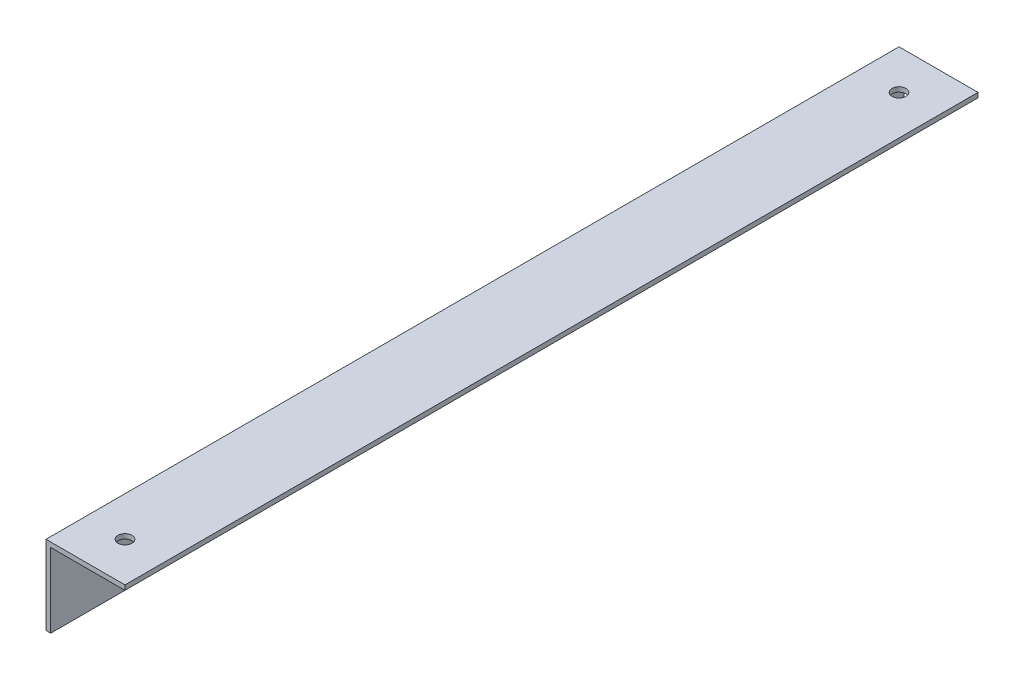
ISO-10303-21;
HEADER;
FILE_DESCRIPTION(('STEP AP214'),'2;1');
FILE_NAME('part.step','',(''),(''),'','','');
FILE_SCHEMA(('AUTOMOTIVE_DESIGN { 1 0 10303 214 1 1 1 1 }'));
ENDSEC;
DATA;
#1=APPLICATION_CONTEXT('core data for automotive mechanical design processes');
#2=APPLICATION_PROTOCOL_DEFINITION('international standard','automotive_design',2000,#1);
#3=PRODUCT_CONTEXT('',#1,'mechanical');
#4=PRODUCT('Part','Part','',(#3));
#5=PRODUCT_RELATED_PRODUCT_CATEGORY('part','',(#4));
#6=PRODUCT_DEFINITION_FORMATION('','',#4);
#7=PRODUCT_DEFINITION_CONTEXT('part definition',#1,'design');
#8=PRODUCT_DEFINITION('design','',#6,#7);
#9=PRODUCT_DEFINITION_SHAPE('','',#8);
#10=(LENGTH_UNIT() NAMED_UNIT(*) SI_UNIT(.MILLI.,.METRE.));
#11=(NAMED_UNIT(*) PLANE_ANGLE_UNIT() SI_UNIT($,.RADIAN.));
#12=(NAMED_UNIT(*) SI_UNIT($,.STERADIAN.) SOLID_ANGLE_UNIT());
#13=UNCERTAINTY_MEASURE_WITH_UNIT(LENGTH_MEASURE(1.E-05),#10,'distance_accuracy_value','');
#14=(GEOMETRIC_REPRESENTATION_CONTEXT(3) GLOBAL_UNCERTAINTY_ASSIGNED_CONTEXT((#13)) GLOBAL_UNIT_ASSIGNED_CONTEXT((#10,
#11,#12)) REPRESENTATION_CONTEXT('',''));
#15=CARTESIAN_POINT('',(0.,0.,0.));
#16=DIRECTION('',(0.,0.,1.));
#17=DIRECTION('',(1.,0.,0.));
#18=AXIS2_PLACEMENT_3D('',#15,#16,#17);
#19=CARTESIAN_POINT('',(0.,0.,270.));
#20=DIRECTION('',(0.,-1.,0.));
#21=DIRECTION('',(0.,0.,-1.));
#22=AXIS2_PLACEMENT_3D('',#19,#20,#21);
#23=PLANE('',#22);
#24=CARTESIAN_POINT('',(12.5,0.,257.5));
#25=DIRECTION('',(0.,1.,0.));
#26=DIRECTION('',(0.,0.,1.));
#27=AXIS2_PLACEMENT_3D('',#24,#25,#26);
#28=CIRCLE('',#27,2.19999999999999);
#29=CARTESIAN_POINT('',(12.5,0.,259.7));
#30=VERTEX_POINT('',#29);
#31=EDGE_CURVE('E163',#30,#30,#28,.T.);
#32=ORIENTED_EDGE('',*,*,#31,.F.);
#33=EDGE_LOOP('',(#32));
#34=FACE_BOUND('',#33,.T.);
#35=CARTESIAN_POINT('',(12.5,0.,12.5));
#36=DIRECTION('',(0.,1.,0.));
#37=DIRECTION('',(0.,0.,1.));
#38=AXIS2_PLACEMENT_3D('',#35,#36,#37);
#39=CIRCLE('',#38,2.2);
#40=CARTESIAN_POINT('',(12.5,0.,14.7));
#41=VERTEX_POINT('',#40);
#42=EDGE_CURVE('E166',#41,#41,#39,.T.);
#43=ORIENTED_EDGE('',*,*,#42,.F.);
#44=EDGE_LOOP('',(#43));
#45=FACE_BOUND('',#44,.T.);
#46=DIRECTION('',(-1.,0.,0.));
#47=VECTOR('',#46,1.);
#48=CARTESIAN_POINT('',(0.,0.,0.));
#49=LINE('',#48,#47);
#50=CARTESIAN_POINT('',(25.,0.,0.));
#51=VERTEX_POINT('',#50);
#52=CARTESIAN_POINT('',(0.,0.,0.));
#53=VERTEX_POINT('',#52);
#54=EDGE_CURVE('E117',#51,#53,#49,.T.);
#55=ORIENTED_EDGE('',*,*,#54,.T.);
#56=DIRECTION('',(0.,0.,-1.));
#57=VECTOR('',#56,1.);
#58=CARTESIAN_POINT('',(0.,0.,270.));
#59=LINE('',#58,#57);
#60=CARTESIAN_POINT('',(0.,0.,270.));
#61=VERTEX_POINT('',#60);
#62=EDGE_CURVE('E11',#61,#53,#59,.T.);
#63=ORIENTED_EDGE('',*,*,#62,.F.);
#64=DIRECTION('',(-1.,0.,0.));
#65=VECTOR('',#64,1.);
#66=CARTESIAN_POINT('',(0.,0.,270.));
#67=LINE('',#66,#65);
#68=CARTESIAN_POINT('',(25.,0.,270.));
#69=VERTEX_POINT('',#68);
#70=EDGE_CURVE('E128',#69,#61,#67,.T.);
#71=ORIENTED_EDGE('',*,*,#70,.F.);
#72=DIRECTION('',(0.,0.,-1.));
#73=VECTOR('',#72,1.);
#74=CARTESIAN_POINT('',(25.,0.,270.));
#75=LINE('',#74,#73);
#76=EDGE_CURVE('E113',#69,#51,#75,.T.);
#77=ORIENTED_EDGE('',*,*,#76,.T.);
#78=EDGE_LOOP('',(#55,#63,#71,#77));
#79=FACE_BOUND('',#78,.T.);
#80=ADVANCED_FACE('F33',(#34,#45,#79),#23,.F.);
#81=CARTESIAN_POINT('',(0.,0.,270.));
#82=DIRECTION('',(1.,0.,0.));
#83=DIRECTION('',(0.,1.,0.));
#84=AXIS2_PLACEMENT_3D('',#81,#82,#83);
#85=PLANE('',#84);
#86=DIRECTION('',(0.,-1.,0.));
#87=VECTOR('',#86,1.);
#88=CARTESIAN_POINT('',(0.,0.,0.));
#89=LINE('',#88,#87);
#90=CARTESIAN_POINT('',(0.,-25.,0.));
#91=VERTEX_POINT('',#90);
#92=EDGE_CURVE('E120',#53,#91,#89,.T.);
#93=ORIENTED_EDGE('',*,*,#92,.T.);
#94=DIRECTION('',(0.,0.,-1.));
#95=VECTOR('',#94,1.);
#96=CARTESIAN_POINT('',(0.,-25.,270.));
#97=LINE('',#96,#95);
#98=CARTESIAN_POINT('',(0.,-25.,270.));
#99=VERTEX_POINT('',#98);
#100=EDGE_CURVE('E41',#99,#91,#97,.T.);
#101=ORIENTED_EDGE('',*,*,#100,.F.);
#102=DIRECTION('',(0.,-1.,0.));
#103=VECTOR('',#102,1.);
#104=CARTESIAN_POINT('',(0.,0.,270.));
#105=LINE('',#104,#103);
#106=EDGE_CURVE('E86',#61,#99,#105,.T.);
#107=ORIENTED_EDGE('',*,*,#106,.F.);
#108=ORIENTED_EDGE('',*,*,#62,.T.);
#109=EDGE_LOOP('',(#93,#101,#107,#108));
#110=FACE_BOUND('',#109,.T.);
#111=ADVANCED_FACE('F154',(#110),#85,.F.);
#112=CARTESIAN_POINT('',(0.,-25.,270.));
#113=DIRECTION('',(0.,1.,0.));
#114=DIRECTION('',(0.,0.,1.));
#115=AXIS2_PLACEMENT_3D('',#112,#113,#114);
#116=PLANE('',#115);
#117=DIRECTION('',(1.,0.,0.));
#118=VECTOR('',#117,1.);
#119=CARTESIAN_POINT('',(0.,-25.,0.));
#120=LINE('',#119,#118);
#121=CARTESIAN_POINT('',(1.5,-25.,0.));
#122=VERTEX_POINT('',#121);
#123=EDGE_CURVE('E123',#91,#122,#120,.T.);
#124=ORIENTED_EDGE('',*,*,#123,.T.);
#125=DIRECTION('',(0.,0.,-1.));
#126=VECTOR('',#125,1.);
#127=CARTESIAN_POINT('',(1.5,-25.,270.));
#128=LINE('',#127,#126);
#129=CARTESIAN_POINT('',(1.5,-25.,270.));
#130=VERTEX_POINT('',#129);
#131=EDGE_CURVE('E108',#130,#122,#128,.T.);
#132=ORIENTED_EDGE('',*,*,#131,.F.);
#133=DIRECTION('',(1.,0.,0.));
#134=VECTOR('',#133,1.);
#135=CARTESIAN_POINT('',(0.,-25.,270.));
#136=LINE('',#135,#134);
#137=EDGE_CURVE('E99',#99,#130,#136,.T.);
#138=ORIENTED_EDGE('',*,*,#137,.F.);
#139=ORIENTED_EDGE('',*,*,#100,.T.);
#140=EDGE_LOOP('',(#124,#132,#138,#139));
#141=FACE_BOUND('',#140,.T.);
#142=ADVANCED_FACE('F134',(#141),#116,.F.);
#143=CARTESIAN_POINT('',(1.5,-25.,270.));
#144=DIRECTION('',(-1.,0.,0.));
#145=DIRECTION('',(0.,0.,1.));
#146=AXIS2_PLACEMENT_3D('',#143,#144,#145);
#147=PLANE('',#146);
#148=DIRECTION('',(0.,1.,0.));
#149=VECTOR('',#148,1.);
#150=CARTESIAN_POINT('',(1.5,-25.,0.));
#151=LINE('',#150,#149);
#152=CARTESIAN_POINT('',(1.5,-1.5,0.));
#153=VERTEX_POINT('',#152);
#154=EDGE_CURVE('E107',#122,#153,#151,.T.);
#155=ORIENTED_EDGE('',*,*,#154,.T.);
#156=DIRECTION('',(0.,0.,-1.));
#157=VECTOR('',#156,1.);
#158=CARTESIAN_POINT('',(1.5,-1.5,270.));
#159=LINE('',#158,#157);
#160=CARTESIAN_POINT('',(1.5,-1.5,270.));
#161=VERTEX_POINT('',#160);
#162=EDGE_CURVE('E104',#161,#153,#159,.T.);
#163=ORIENTED_EDGE('',*,*,#162,.F.);
#164=DIRECTION('',(0.,1.,0.));
#165=VECTOR('',#164,1.);
#166=CARTESIAN_POINT('',(1.5,-25.,270.));
#167=LINE('',#166,#165);
#168=EDGE_CURVE('E93',#130,#161,#167,.T.);
#169=ORIENTED_EDGE('',*,*,#168,.F.);
#170=ORIENTED_EDGE('',*,*,#131,.T.);
#171=EDGE_LOOP('',(#155,#163,#169,#170));
#172=FACE_BOUND('',#171,.T.);
#173=ADVANCED_FACE('F105',(#172),#147,.F.);
#174=CARTESIAN_POINT('',(1.5,-1.5,270.));
#175=DIRECTION('',(0.,1.,0.));
#176=DIRECTION('',(0.,0.,1.));
#177=AXIS2_PLACEMENT_3D('',#174,#175,#176);
#178=PLANE('',#177);
#179=CARTESIAN_POINT('',(12.5,-1.5,257.5));
#180=DIRECTION('',(0.,1.,0.));
#181=DIRECTION('',(0.,0.,1.));
#182=AXIS2_PLACEMENT_3D('',#179,#180,#181);
#183=CIRCLE('',#182,2.19999999999999);
#184=CARTESIAN_POINT('',(12.5,-1.5,259.7));
#185=VERTEX_POINT('',#184);
#186=EDGE_CURVE('E121',#185,#185,#183,.F.);
#187=ORIENTED_EDGE('',*,*,#186,.F.);
#188=EDGE_LOOP('',(#187));
#189=FACE_BOUND('',#188,.T.);
#190=CARTESIAN_POINT('',(12.5,-1.5,12.5));
#191=DIRECTION('',(0.,1.,0.));
#192=DIRECTION('',(0.,0.,1.));
#193=AXIS2_PLACEMENT_3D('',#190,#191,#192);
#194=CIRCLE('',#193,2.2);
#195=CARTESIAN_POINT('',(12.5,-1.5,14.7));
#196=VERTEX_POINT('',#195);
#197=EDGE_CURVE('E168',#196,#196,#194,.F.);
#198=ORIENTED_EDGE('',*,*,#197,.F.);
#199=EDGE_LOOP('',(#198));
#200=FACE_BOUND('',#199,.T.);
#201=DIRECTION('',(1.,0.,0.));
#202=VECTOR('',#201,1.);
#203=CARTESIAN_POINT('',(1.5,-1.5,0.));
#204=LINE('',#203,#202);
#205=CARTESIAN_POINT('',(25.,-1.5,0.));
#206=VERTEX_POINT('',#205);
#207=EDGE_CURVE('E72',#153,#206,#204,.T.);
#208=ORIENTED_EDGE('',*,*,#207,.T.);
#209=DIRECTION('',(0.,0.,-1.));
#210=VECTOR('',#209,1.);
#211=CARTESIAN_POINT('',(25.,-1.5,270.));
#212=LINE('',#211,#210);
#213=CARTESIAN_POINT('',(25.,-1.5,270.));
#214=VERTEX_POINT('',#213);
#215=EDGE_CURVE('E109',#214,#206,#212,.T.);
#216=ORIENTED_EDGE('',*,*,#215,.F.);
#217=DIRECTION('',(1.,0.,0.));
#218=VECTOR('',#217,1.);
#219=CARTESIAN_POINT('',(1.5,-1.5,270.));
#220=LINE('',#219,#218);
#221=EDGE_CURVE('E97',#161,#214,#220,.T.);
#222=ORIENTED_EDGE('',*,*,#221,.F.);
#223=ORIENTED_EDGE('',*,*,#162,.T.);
#224=EDGE_LOOP('',(#208,#216,#222,#223));
#225=FACE_BOUND('',#224,.T.);
#226=ADVANCED_FACE('F111',(#189,#200,#225),#178,.F.);
#227=CARTESIAN_POINT('',(25.,-1.5,270.));
#228=DIRECTION('',(-1.,0.,0.));
#229=DIRECTION('',(0.,0.,1.));
#230=AXIS2_PLACEMENT_3D('',#227,#228,#229);
#231=PLANE('',#230);
#232=DIRECTION('',(0.,1.,0.));
#233=VECTOR('',#232,1.);
#234=CARTESIAN_POINT('',(25.,-1.5,0.));
#235=LINE('',#234,#233);
#236=EDGE_CURVE('E78',#206,#51,#235,.T.);
#237=ORIENTED_EDGE('',*,*,#236,.T.);
#238=ORIENTED_EDGE('',*,*,#76,.F.);
#239=DIRECTION('',(0.,1.,0.));
#240=VECTOR('',#239,1.);
#241=CARTESIAN_POINT('',(25.,-1.5,270.));
#242=LINE('',#241,#240);
#243=EDGE_CURVE('E49',#214,#69,#242,.T.);
#244=ORIENTED_EDGE('',*,*,#243,.F.);
#245=ORIENTED_EDGE('',*,*,#215,.T.);
#246=EDGE_LOOP('',(#237,#238,#244,#245));
#247=FACE_BOUND('',#246,.T.);
#248=ADVANCED_FACE('F141',(#247),#231,.F.);
#249=CARTESIAN_POINT('',(0.,0.,270.));
#250=DIRECTION('',(0.,0.,1.));
#251=DIRECTION('',(1.,0.,0.));
#252=AXIS2_PLACEMENT_3D('',#249,#250,#251);
#253=PLANE('',#252);
#254=ORIENTED_EDGE('',*,*,#70,.T.);
#255=ORIENTED_EDGE('',*,*,#106,.T.);
#256=ORIENTED_EDGE('',*,*,#137,.T.);
#257=ORIENTED_EDGE('',*,*,#168,.T.);
#258=ORIENTED_EDGE('',*,*,#221,.T.);
#259=ORIENTED_EDGE('',*,*,#243,.T.);
#260=EDGE_LOOP('',(#254,#255,#256,#257,#258,#259));
#261=FACE_BOUND('',#260,.T.);
#262=ADVANCED_FACE('F95',(#261),#253,.T.);
#263=CARTESIAN_POINT('',(0.,0.,0.));
#264=DIRECTION('',(0.,0.,1.));
#265=DIRECTION('',(1.,0.,0.));
#266=AXIS2_PLACEMENT_3D('',#263,#264,#265);
#267=PLANE('',#266);
#268=ORIENTED_EDGE('',*,*,#54,.F.);
#269=ORIENTED_EDGE('',*,*,#236,.F.);
#270=ORIENTED_EDGE('',*,*,#207,.F.);
#271=ORIENTED_EDGE('',*,*,#154,.F.);
#272=ORIENTED_EDGE('',*,*,#123,.F.);
#273=ORIENTED_EDGE('',*,*,#92,.F.);
#274=EDGE_LOOP('',(#268,#269,#270,#271,#272,#273));
#275=FACE_BOUND('',#274,.T.);
#276=ADVANCED_FACE('F137',(#275),#267,.F.);
#277=CARTESIAN_POINT('',(12.5,-25.001,12.5));
#278=DIRECTION('',(0.,1.,0.));
#279=DIRECTION('',(0.,0.,1.));
#280=AXIS2_PLACEMENT_3D('',#277,#278,#279);
#281=CYLINDRICAL_SURFACE('',#280,2.2);
#282=ORIENTED_EDGE('',*,*,#42,.T.);
#283=EDGE_LOOP('',(#282));
#284=FACE_BOUND('',#283,.T.);
#285=ORIENTED_EDGE('',*,*,#197,.T.);
#286=EDGE_LOOP('',(#285));
#287=FACE_BOUND('',#286,.T.);
#288=ADVANCED_FACE('F181',(#284,#287),#281,.F.);
#289=CARTESIAN_POINT('',(12.5,-25.001,257.5));
#290=DIRECTION('',(0.,1.,0.));
#291=DIRECTION('',(0.,0.,1.));
#292=AXIS2_PLACEMENT_3D('',#289,#290,#291);
#293=CYLINDRICAL_SURFACE('',#292,2.19999999999999);
#294=ORIENTED_EDGE('',*,*,#31,.T.);
#295=EDGE_LOOP('',(#294));
#296=FACE_BOUND('',#295,.T.);
#297=ORIENTED_EDGE('',*,*,#186,.T.);
#298=EDGE_LOOP('',(#297));
#299=FACE_BOUND('',#298,.T.);
#300=ADVANCED_FACE('F178',(#296,#299),#293,.F.);
#301=CLOSED_SHELL('',(#80,#111,#142,#173,#226,#248,#262,#276,#288,#300));
#302=MANIFOLD_SOLID_BREP('B2',#301);
#303=ADVANCED_BREP_SHAPE_REPRESENTATION('',(#18,#302),#14);
#304=SHAPE_DEFINITION_REPRESENTATION(#9,#303);
ENDSEC;
END-ISO-10303-21;
